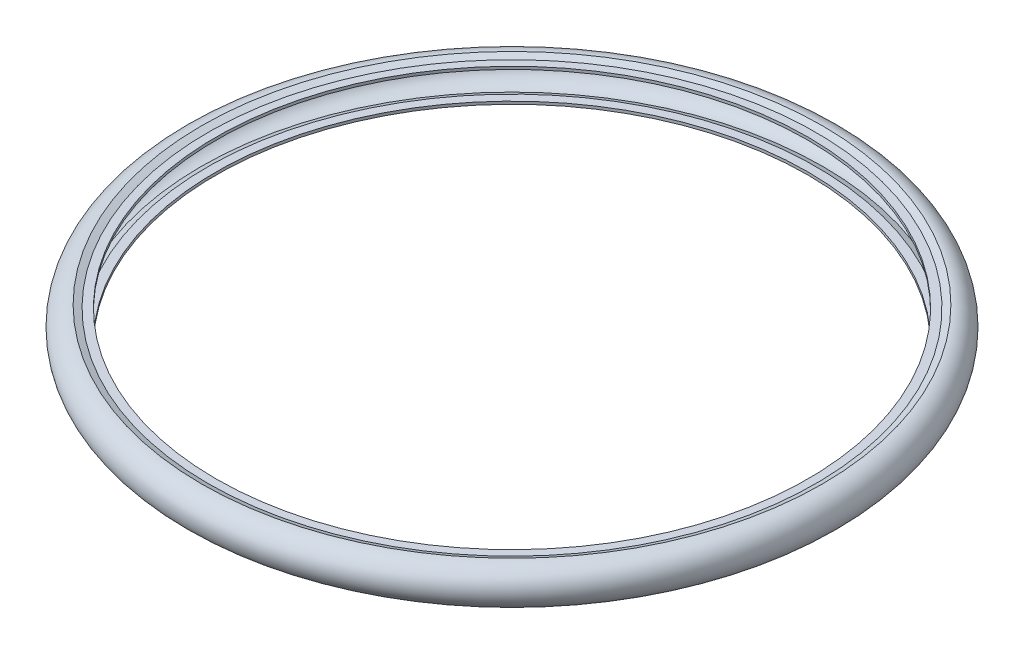
ISO-10303-21;
HEADER;
FILE_DESCRIPTION(('STEP AP214'),'2;1');
FILE_NAME('part.step','',(''),(''),'','','');
FILE_SCHEMA(('AUTOMOTIVE_DESIGN { 1 0 10303 214 1 1 1 1 }'));
ENDSEC;
DATA;
#1=APPLICATION_CONTEXT('core data for automotive mechanical design processes');
#2=APPLICATION_PROTOCOL_DEFINITION('international standard','automotive_design',2000,#1);
#3=PRODUCT_CONTEXT('',#1,'mechanical');
#4=PRODUCT('Part','Part','',(#3));
#5=PRODUCT_RELATED_PRODUCT_CATEGORY('part','',(#4));
#6=PRODUCT_DEFINITION_FORMATION('','',#4);
#7=PRODUCT_DEFINITION_CONTEXT('part definition',#1,'design');
#8=PRODUCT_DEFINITION('design','',#6,#7);
#9=PRODUCT_DEFINITION_SHAPE('','',#8);
#10=(LENGTH_UNIT() NAMED_UNIT(*) SI_UNIT(.MILLI.,.METRE.));
#11=(NAMED_UNIT(*) PLANE_ANGLE_UNIT() SI_UNIT($,.RADIAN.));
#12=(NAMED_UNIT(*) SI_UNIT($,.STERADIAN.) SOLID_ANGLE_UNIT());
#13=UNCERTAINTY_MEASURE_WITH_UNIT(LENGTH_MEASURE(1.E-05),#10,'distance_accuracy_value','');
#14=(GEOMETRIC_REPRESENTATION_CONTEXT(3) GLOBAL_UNCERTAINTY_ASSIGNED_CONTEXT((#13)) GLOBAL_UNIT_ASSIGNED_CONTEXT((#10,
#11,#12)) REPRESENTATION_CONTEXT('',''));
#15=CARTESIAN_POINT('',(0.,0.,0.));
#16=DIRECTION('',(0.,0.,1.));
#17=DIRECTION('',(1.,0.,0.));
#18=AXIS2_PLACEMENT_3D('',#15,#16,#17);
#19=CARTESIAN_POINT('',(0.,10.,-217.594560556485));
#20=DIRECTION('',(0.,1.,0.));
#21=DIRECTION('',(0.,0.,1.));
#22=AXIS2_PLACEMENT_3D('',#19,#20,#21);
#23=PLANE('',#22);
#24=CARTESIAN_POINT('',(0.,10.,0.));
#25=DIRECTION('',(0.,1.,0.));
#26=DIRECTION('',(0.,0.,1.));
#27=AXIS2_PLACEMENT_3D('',#24,#25,#26);
#28=CIRCLE('',#27,221.846794435939);
#29=CARTESIAN_POINT('',(0.,10.,221.846794435939));
#30=VERTEX_POINT('',#29);
#31=EDGE_CURVE('E72',#30,#30,#28,.T.);
#32=ORIENTED_EDGE('',*,*,#31,.F.);
#33=EDGE_LOOP('',(#32));
#34=FACE_BOUND('',#33,.T.);
#35=CARTESIAN_POINT('',(0.,10.,0.));
#36=DIRECTION('',(0.,1.,0.));
#37=DIRECTION('',(0.,0.,1.));
#38=AXIS2_PLACEMENT_3D('',#35,#36,#37);
#39=CIRCLE('',#38,215.594560556485);
#40=CARTESIAN_POINT('',(0.,10.,215.594560556485));
#41=VERTEX_POINT('',#40);
#42=EDGE_CURVE('E10',#41,#41,#39,.T.);
#43=ORIENTED_EDGE('',*,*,#42,.T.);
#44=EDGE_LOOP('',(#43));
#45=FACE_BOUND('',#44,.T.);
#46=ADVANCED_FACE('F32',(#34,#45),#23,.F.);
#47=CARTESIAN_POINT('',(0.,21.8973894640158,0.));
#48=DIRECTION('',(0.,1.,0.));
#49=DIRECTION('',(0.,0.,1.));
#50=AXIS2_PLACEMENT_3D('',#47,#48,#49);
#51=CYLINDRICAL_SURFACE('',#50,215.594560556485);
#52=ORIENTED_EDGE('',*,*,#42,.F.);
#53=EDGE_LOOP('',(#52));
#54=FACE_BOUND('',#53,.T.);
#55=CARTESIAN_POINT('',(0.,12.,0.));
#56=DIRECTION('',(0.,1.,0.));
#57=DIRECTION('',(0.,0.,1.));
#58=AXIS2_PLACEMENT_3D('',#55,#56,#57);
#59=CIRCLE('',#58,215.594560556485);
#60=CARTESIAN_POINT('',(0.,12.,215.594560556485));
#61=VERTEX_POINT('',#60);
#62=EDGE_CURVE('E38',#61,#61,#59,.T.);
#63=ORIENTED_EDGE('',*,*,#62,.T.);
#64=EDGE_LOOP('',(#63));
#65=FACE_BOUND('',#64,.T.);
#66=ADVANCED_FACE('F79',(#54,#65),#51,.F.);
#67=CARTESIAN_POINT('',(0.,12.,-215.594560556485));
#68=DIRECTION('',(0.,-1.,0.));
#69=DIRECTION('',(0.,0.,-1.));
#70=AXIS2_PLACEMENT_3D('',#67,#68,#69);
#71=PLANE('',#70);
#72=ORIENTED_EDGE('',*,*,#62,.F.);
#73=EDGE_LOOP('',(#72));
#74=FACE_BOUND('',#73,.T.);
#75=CARTESIAN_POINT('',(0.,12.,0.));
#76=DIRECTION('',(0.,1.,0.));
#77=DIRECTION('',(0.,0.,1.));
#78=AXIS2_PLACEMENT_3D('',#75,#76,#77);
#79=CIRCLE('',#78,221.437329759038);
#80=CARTESIAN_POINT('',(0.,12.,221.437329759038));
#81=VERTEX_POINT('',#80);
#82=EDGE_CURVE('E42',#81,#81,#79,.T.);
#83=ORIENTED_EDGE('',*,*,#82,.T.);
#84=EDGE_LOOP('',(#83));
#85=FACE_BOUND('',#84,.T.);
#86=ADVANCED_FACE('F83',(#74,#85),#71,.F.);
#87=CARTESIAN_POINT('',(0.,13.9649613790611,0.));
#88=DIRECTION('',(0.,1.,0.));
#89=DIRECTION('',(0.,0.,1.));
#90=AXIS2_PLACEMENT_3D('',#87,#88,#89);
#91=CONICAL_SURFACE('',#90,226.035038620939,1.16691289352262);
#92=ORIENTED_EDGE('',*,*,#82,.F.);
#93=EDGE_LOOP('',(#92));
#94=FACE_BOUND('',#93,.T.);
#95=CARTESIAN_POINT('',(0.,13.9649613790611,0.));
#96=DIRECTION('',(0.,1.,0.));
#97=DIRECTION('',(0.,0.,1.));
#98=AXIS2_PLACEMENT_3D('',#95,#96,#97);
#99=CIRCLE('',#98,226.035038620939);
#100=CARTESIAN_POINT('',(0.,13.9649613790611,226.035038620939));
#101=VERTEX_POINT('',#100);
#102=EDGE_CURVE('E46',#101,#101,#99,.T.);
#103=ORIENTED_EDGE('',*,*,#102,.T.);
#104=EDGE_LOOP('',(#103));
#105=FACE_BOUND('',#104,.T.);
#106=ADVANCED_FACE('F88',(#94,#105),#91,.F.);
#107=CARTESIAN_POINT('',(0.,0.,0.));
#108=DIRECTION('',(0.,1.,0.));
#109=DIRECTION('',(0.,0.,1.));
#110=AXIS2_PLACEMENT_3D('',#107,#108,#109);
#111=TOROIDAL_SURFACE('',#110,226.035038620939,13.9649613790611);
#112=ORIENTED_EDGE('',*,*,#102,.F.);
#113=EDGE_LOOP('',(#112));
#114=FACE_BOUND('',#113,.T.);
#115=CARTESIAN_POINT('',(0.,-13.9649613790611,0.));
#116=DIRECTION('',(0.,1.,0.));
#117=DIRECTION('',(0.,0.,1.));
#118=AXIS2_PLACEMENT_3D('',#115,#116,#117);
#119=CIRCLE('',#118,226.035038620939);
#120=CARTESIAN_POINT('',(0.,-13.9649613790611,226.035038620939));
#121=VERTEX_POINT('',#120);
#122=EDGE_CURVE('E51',#121,#121,#119,.T.);
#123=ORIENTED_EDGE('',*,*,#122,.T.);
#124=EDGE_LOOP('',(#123));
#125=FACE_BOUND('',#124,.T.);
#126=ADVANCED_FACE('F94',(#114,#125),#111,.T.);
#127=CARTESIAN_POINT('',(0.,-12.,0.));
#128=DIRECTION('',(0.,-1.,0.));
#129=DIRECTION('',(0.,0.,-1.));
#130=AXIS2_PLACEMENT_3D('',#127,#128,#129);
#131=CONICAL_SURFACE('',#130,221.437329759038,1.16691289352262);
#132=ORIENTED_EDGE('',*,*,#122,.F.);
#133=EDGE_LOOP('',(#132));
#134=FACE_BOUND('',#133,.T.);
#135=CARTESIAN_POINT('',(0.,-12.,0.));
#136=DIRECTION('',(0.,1.,0.));
#137=DIRECTION('',(0.,0.,1.));
#138=AXIS2_PLACEMENT_3D('',#135,#136,#137);
#139=CIRCLE('',#138,221.437329759038);
#140=CARTESIAN_POINT('',(0.,-12.,221.437329759038));
#141=VERTEX_POINT('',#140);
#142=EDGE_CURVE('E54',#141,#141,#139,.T.);
#143=ORIENTED_EDGE('',*,*,#142,.T.);
#144=EDGE_LOOP('',(#143));
#145=FACE_BOUND('',#144,.T.);
#146=ADVANCED_FACE('F98',(#134,#145),#131,.F.);
#147=CARTESIAN_POINT('',(0.,-12.,-215.594560556485));
#148=DIRECTION('',(0.,1.,0.));
#149=DIRECTION('',(0.,0.,1.));
#150=AXIS2_PLACEMENT_3D('',#147,#148,#149);
#151=PLANE('',#150);
#152=ORIENTED_EDGE('',*,*,#142,.F.);
#153=EDGE_LOOP('',(#152));
#154=FACE_BOUND('',#153,.T.);
#155=CARTESIAN_POINT('',(0.,-12.,0.));
#156=DIRECTION('',(0.,1.,0.));
#157=DIRECTION('',(0.,0.,1.));
#158=AXIS2_PLACEMENT_3D('',#155,#156,#157);
#159=CIRCLE('',#158,215.594560556485);
#160=CARTESIAN_POINT('',(0.,-12.,215.594560556485));
#161=VERTEX_POINT('',#160);
#162=EDGE_CURVE('E57',#161,#161,#159,.T.);
#163=ORIENTED_EDGE('',*,*,#162,.T.);
#164=EDGE_LOOP('',(#163));
#165=FACE_BOUND('',#164,.T.);
#166=ADVANCED_FACE('F102',(#154,#165),#151,.F.);
#167=CARTESIAN_POINT('',(0.,21.8973894640158,0.));
#168=DIRECTION('',(0.,1.,0.));
#169=DIRECTION('',(0.,0.,1.));
#170=AXIS2_PLACEMENT_3D('',#167,#168,#169);
#171=CYLINDRICAL_SURFACE('',#170,215.594560556485);
#172=ORIENTED_EDGE('',*,*,#162,.F.);
#173=EDGE_LOOP('',(#172));
#174=FACE_BOUND('',#173,.T.);
#175=CARTESIAN_POINT('',(0.,-10.,0.));
#176=DIRECTION('',(0.,1.,0.));
#177=DIRECTION('',(0.,0.,1.));
#178=AXIS2_PLACEMENT_3D('',#175,#176,#177);
#179=CIRCLE('',#178,215.594560556485);
#180=CARTESIAN_POINT('',(0.,-10.,215.594560556485));
#181=VERTEX_POINT('',#180);
#182=EDGE_CURVE('E60',#181,#181,#179,.T.);
#183=ORIENTED_EDGE('',*,*,#182,.T.);
#184=EDGE_LOOP('',(#183));
#185=FACE_BOUND('',#184,.T.);
#186=ADVANCED_FACE('F106',(#174,#185),#171,.F.);
#187=CARTESIAN_POINT('',(0.,-10.,-217.594560556485));
#188=DIRECTION('',(0.,-1.,0.));
#189=DIRECTION('',(0.,0.,-1.));
#190=AXIS2_PLACEMENT_3D('',#187,#188,#189);
#191=PLANE('',#190);
#192=ORIENTED_EDGE('',*,*,#182,.F.);
#193=EDGE_LOOP('',(#192));
#194=FACE_BOUND('',#193,.T.);
#195=CARTESIAN_POINT('',(0.,-10.,0.));
#196=DIRECTION('',(0.,1.,0.));
#197=DIRECTION('',(0.,0.,1.));
#198=AXIS2_PLACEMENT_3D('',#195,#196,#197);
#199=CIRCLE('',#198,221.846794435939);
#200=CARTESIAN_POINT('',(0.,-10.,221.846794435939));
#201=VERTEX_POINT('',#200);
#202=EDGE_CURVE('E63',#201,#201,#199,.T.);
#203=ORIENTED_EDGE('',*,*,#202,.T.);
#204=EDGE_LOOP('',(#203));
#205=FACE_BOUND('',#204,.T.);
#206=ADVANCED_FACE('F110',(#194,#205),#191,.F.);
#207=CARTESIAN_POINT('',(0.,-11.9584638910296,0.));
#208=DIRECTION('',(0.,-1.,0.));
#209=DIRECTION('',(0.,0.,-1.));
#210=AXIS2_PLACEMENT_3D('',#207,#208,#209);
#211=CONICAL_SURFACE('',#210,226.429300170378,1.16691289352262);
#212=ORIENTED_EDGE('',*,*,#202,.F.);
#213=EDGE_LOOP('',(#212));
#214=FACE_BOUND('',#213,.T.);
#215=CARTESIAN_POINT('',(0.,-11.9584638910296,0.));
#216=DIRECTION('',(0.,1.,0.));
#217=DIRECTION('',(0.,0.,1.));
#218=AXIS2_PLACEMENT_3D('',#215,#216,#217);
#219=CIRCLE('',#218,226.429300170378);
#220=CARTESIAN_POINT('',(0.,-11.9584638910296,226.429300170378));
#221=VERTEX_POINT('',#220);
#222=EDGE_CURVE('E66',#221,#221,#219,.T.);
#223=ORIENTED_EDGE('',*,*,#222,.T.);
#224=EDGE_LOOP('',(#223));
#225=FACE_BOUND('',#224,.T.);
#226=ADVANCED_FACE('F114',(#214,#225),#211,.T.);
#227=CARTESIAN_POINT('',(0.,0.,0.));
#228=DIRECTION('',(0.,1.,0.));
#229=DIRECTION('',(0.,0.,1.));
#230=AXIS2_PLACEMENT_3D('',#227,#228,#229);
#231=TOROIDAL_SURFACE('',#230,226.035038620939,11.9649613790611);
#232=ORIENTED_EDGE('',*,*,#222,.F.);
#233=EDGE_LOOP('',(#232));
#234=FACE_BOUND('',#233,.T.);
#235=CARTESIAN_POINT('',(0.,11.9584638910296,0.));
#236=DIRECTION('',(0.,1.,0.));
#237=DIRECTION('',(0.,0.,1.));
#238=AXIS2_PLACEMENT_3D('',#235,#236,#237);
#239=CIRCLE('',#238,226.429300170378);
#240=CARTESIAN_POINT('',(0.,11.9584638910296,226.429300170378));
#241=VERTEX_POINT('',#240);
#242=EDGE_CURVE('E69',#241,#241,#239,.T.);
#243=ORIENTED_EDGE('',*,*,#242,.T.);
#244=EDGE_LOOP('',(#243));
#245=FACE_BOUND('',#244,.T.);
#246=ADVANCED_FACE('F118',(#234,#245),#231,.F.);
#247=CARTESIAN_POINT('',(0.,10.,0.));
#248=DIRECTION('',(0.,1.,0.));
#249=DIRECTION('',(0.,0.,1.));
#250=AXIS2_PLACEMENT_3D('',#247,#248,#249);
#251=CONICAL_SURFACE('',#250,221.846794435939,1.16691289352262);
#252=ORIENTED_EDGE('',*,*,#242,.F.);
#253=EDGE_LOOP('',(#252));
#254=FACE_BOUND('',#253,.T.);
#255=ORIENTED_EDGE('',*,*,#31,.T.);
#256=EDGE_LOOP('',(#255));
#257=FACE_BOUND('',#256,.T.);
#258=ADVANCED_FACE('F76',(#254,#257),#251,.T.);
#259=CLOSED_SHELL('',(#46,#66,#86,#106,#126,#146,#166,#186,#206,#226,#246,#258));
#260=MANIFOLD_SOLID_BREP('B2',#259);
#261=ADVANCED_BREP_SHAPE_REPRESENTATION('',(#18,#260),#14);
#262=SHAPE_DEFINITION_REPRESENTATION(#9,#261);
ENDSEC;
END-ISO-10303-21;
